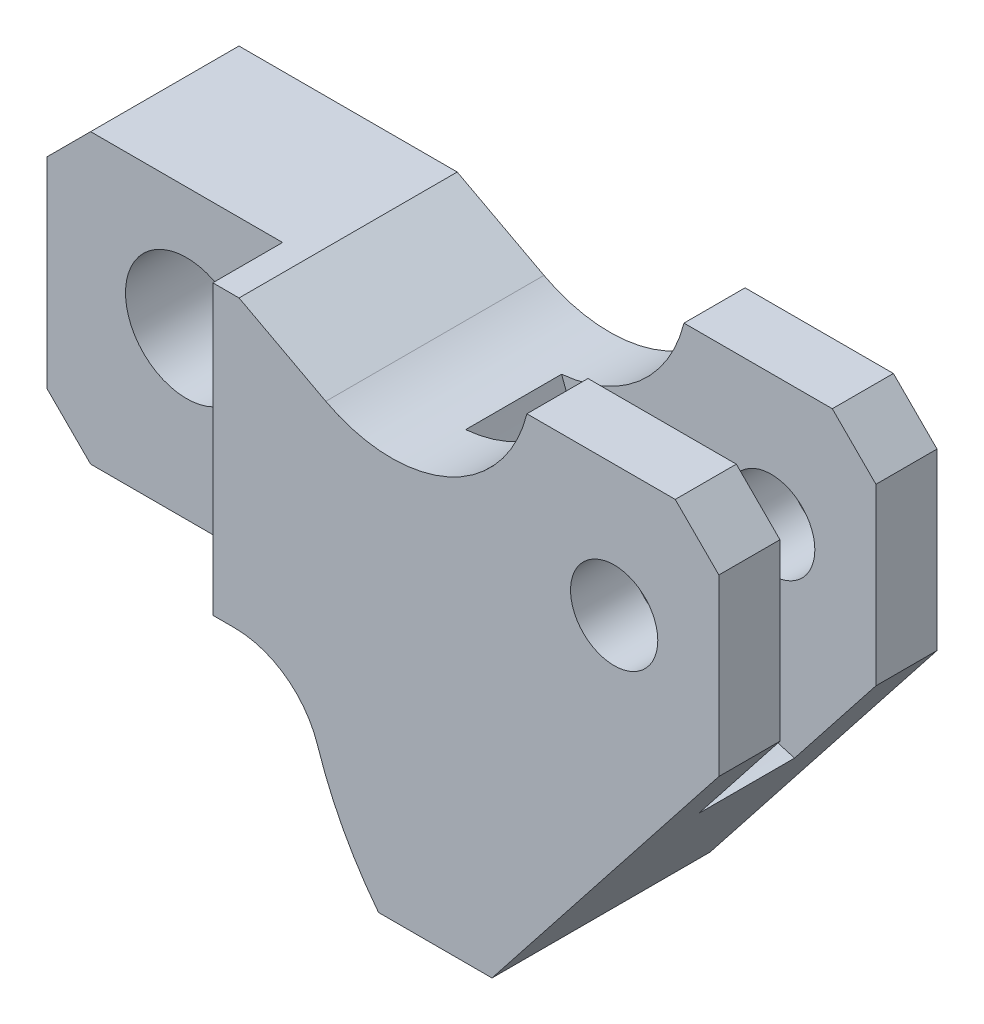
ISO-10303-21;
HEADER;
FILE_DESCRIPTION(('STEP AP214'),'2;1');
FILE_NAME('part.step','',(''),(''),'','','');
FILE_SCHEMA(('AUTOMOTIVE_DESIGN { 1 0 10303 214 1 1 1 1 }'));
ENDSEC;
DATA;
#1=APPLICATION_CONTEXT('core data for automotive mechanical design processes');
#2=APPLICATION_PROTOCOL_DEFINITION('international standard','automotive_design',2000,#1);
#3=PRODUCT_CONTEXT('',#1,'mechanical');
#4=PRODUCT('Part','Part','',(#3));
#5=PRODUCT_RELATED_PRODUCT_CATEGORY('part','',(#4));
#6=PRODUCT_DEFINITION_FORMATION('','',#4);
#7=PRODUCT_DEFINITION_CONTEXT('part definition',#1,'design');
#8=PRODUCT_DEFINITION('design','',#6,#7);
#9=PRODUCT_DEFINITION_SHAPE('','',#8);
#10=(LENGTH_UNIT() NAMED_UNIT(*) SI_UNIT(.MILLI.,.METRE.));
#11=(NAMED_UNIT(*) PLANE_ANGLE_UNIT() SI_UNIT($,.RADIAN.));
#12=(NAMED_UNIT(*) SI_UNIT($,.STERADIAN.) SOLID_ANGLE_UNIT());
#13=UNCERTAINTY_MEASURE_WITH_UNIT(LENGTH_MEASURE(1.E-05),#10,'distance_accuracy_value','');
#14=(GEOMETRIC_REPRESENTATION_CONTEXT(3) GLOBAL_UNCERTAINTY_ASSIGNED_CONTEXT((#13)) GLOBAL_UNIT_ASSIGNED_CONTEXT((#10,
#11,#12)) REPRESENTATION_CONTEXT('',''));
#15=CARTESIAN_POINT('',(0.,0.,0.));
#16=DIRECTION('',(0.,0.,1.));
#17=DIRECTION('',(1.,0.,0.));
#18=AXIS2_PLACEMENT_3D('',#15,#16,#17);
#19=CARTESIAN_POINT('',(37.5323662073748,0.,12.5));
#20=DIRECTION('',(1.,0.,0.));
#21=DIRECTION('',(0.,0.,-1.));
#22=AXIS2_PLACEMENT_3D('',#19,#20,#21);
#23=PLANE('',#22);
#24=DIRECTION('',(0.,0.,-1.));
#25=VECTOR('',#24,1.);
#26=CARTESIAN_POINT('',(37.5323662073748,-28.84,12.5));
#27=LINE('',#26,#25);
#28=CARTESIAN_POINT('',(37.5323662073748,-28.84,12.5));
#29=VERTEX_POINT('',#28);
#30=CARTESIAN_POINT('',(37.5323662073748,-28.84,5.5));
#31=VERTEX_POINT('',#30);
#32=EDGE_CURVE('E359',#29,#31,#27,.T.);
#33=ORIENTED_EDGE('',*,*,#32,.T.);
#34=DIRECTION('',(0.,1.,0.));
#35=VECTOR('',#34,1.);
#36=CARTESIAN_POINT('',(37.5323662073748,-8.84000000000003,5.5));
#37=LINE('',#36,#35);
#38=CARTESIAN_POINT('',(37.5323662073748,-8.84000000000003,5.5));
#39=VERTEX_POINT('',#38);
#40=EDGE_CURVE('E201',#31,#39,#37,.T.);
#41=ORIENTED_EDGE('',*,*,#40,.T.);
#42=DIRECTION('',(0.,0.,1.));
#43=VECTOR('',#42,1.);
#44=CARTESIAN_POINT('',(37.5323662073748,-8.84000000000003,12.5));
#45=LINE('',#44,#43);
#46=CARTESIAN_POINT('',(37.5323662073748,-8.84000000000003,12.5));
#47=VERTEX_POINT('',#46);
#48=EDGE_CURVE('E226',#39,#47,#45,.T.);
#49=ORIENTED_EDGE('',*,*,#48,.T.);
#50=DIRECTION('',(0.,-1.,0.));
#51=VECTOR('',#50,1.);
#52=CARTESIAN_POINT('',(37.5323662073748,0.,12.5));
#53=LINE('',#52,#51);
#54=EDGE_CURVE('E296',#47,#29,#53,.T.);
#55=ORIENTED_EDGE('',*,*,#54,.T.);
#56=EDGE_LOOP('',(#33,#41,#49,#55));
#57=FACE_BOUND('',#56,.T.);
#58=ADVANCED_FACE('F43',(#57),#23,.T.);
#59=CARTESIAN_POINT('',(0.,-3.84000000000001,12.5));
#60=DIRECTION('',(0.,1.,0.));
#61=DIRECTION('',(-1.,0.,0.));
#62=AXIS2_PLACEMENT_3D('',#59,#60,#61);
#63=PLANE('',#62);
#64=DIRECTION('',(0.,0.,-1.));
#65=VECTOR('',#64,1.);
#66=CARTESIAN_POINT('',(32.5323662073748,-3.84,12.5));
#67=LINE('',#66,#65);
#68=CARTESIAN_POINT('',(32.5323662073748,-3.84,12.5));
#69=VERTEX_POINT('',#68);
#70=CARTESIAN_POINT('',(32.5323662073748,-3.84,5.5));
#71=VERTEX_POINT('',#70);
#72=EDGE_CURVE('E216',#69,#71,#67,.T.);
#73=ORIENTED_EDGE('',*,*,#72,.T.);
#74=DIRECTION('',(-1.,0.,0.));
#75=VECTOR('',#74,1.);
#76=CARTESIAN_POINT('',(15.5323662073748,-3.84,5.5));
#77=LINE('',#76,#75);
#78=CARTESIAN_POINT('',(15.5323662073748,-3.84,5.5));
#79=VERTEX_POINT('',#78);
#80=EDGE_CURVE('E428',#71,#79,#77,.T.);
#81=ORIENTED_EDGE('',*,*,#80,.T.);
#82=DIRECTION('',(0.,0.,-1.));
#83=VECTOR('',#82,1.);
#84=CARTESIAN_POINT('',(15.5323662073748,-3.84,12.5));
#85=LINE('',#84,#83);
#86=CARTESIAN_POINT('',(15.5323662073748,-3.84,12.5));
#87=VERTEX_POINT('',#86);
#88=EDGE_CURVE('E353',#87,#79,#85,.T.);
#89=ORIENTED_EDGE('',*,*,#88,.F.);
#90=DIRECTION('',(1.,0.,0.));
#91=VECTOR('',#90,1.);
#92=CARTESIAN_POINT('',(0.,-3.84000000000001,12.5));
#93=LINE('',#92,#91);
#94=EDGE_CURVE('E302',#87,#69,#93,.T.);
#95=ORIENTED_EDGE('',*,*,#94,.T.);
#96=EDGE_LOOP('',(#73,#81,#89,#95));
#97=FACE_BOUND('',#96,.T.);
#98=ADVANCED_FACE('F450',(#97),#63,.T.);
#99=CARTESIAN_POINT('',(32.5323662073748,-3.84,12.5));
#100=DIRECTION('',(-0.707106781186549,-0.707106781186546,0.));
#101=DIRECTION('',(0.,0.,-1.));
#102=AXIS2_PLACEMENT_3D('',#99,#100,#101);
#103=PLANE('',#102);
#104=ORIENTED_EDGE('',*,*,#48,.F.);
#105=DIRECTION('',(-0.707106781186546,0.707106781186549,0.));
#106=VECTOR('',#105,1.);
#107=CARTESIAN_POINT('',(32.5323662073748,-3.84,5.5));
#108=LINE('',#107,#106);
#109=EDGE_CURVE('E422',#39,#71,#108,.T.);
#110=ORIENTED_EDGE('',*,*,#109,.T.);
#111=ORIENTED_EDGE('',*,*,#72,.F.);
#112=DIRECTION('',(0.707106781186546,-0.707106781186549,0.));
#113=VECTOR('',#112,1.);
#114=CARTESIAN_POINT('',(14.3461831036875,14.3461831036874,12.5));
#115=LINE('',#114,#113);
#116=EDGE_CURVE('E235',#47,#69,#115,.F.);
#117=ORIENTED_EDGE('',*,*,#116,.F.);
#118=EDGE_LOOP('',(#104,#110,#111,#117));
#119=FACE_BOUND('',#118,.T.);
#120=ADVANCED_FACE('F444',(#119),#103,.F.);
#121=CARTESIAN_POINT('',(37.1770350140687,-29.2909972838117,12.5));
#122=DIRECTION('',(0.785491672227536,-0.618872226603513,0.));
#123=DIRECTION('',(0.618872226603513,0.785491672227536,0.));
#124=AXIS2_PLACEMENT_3D('',#121,#122,#123);
#125=PLANE('',#124);
#126=DIRECTION('',(0.,0.,1.));
#127=VECTOR('',#126,1.);
#128=CARTESIAN_POINT('',(28.2057199185504,-40.677666443508,-5.5));
#129=LINE('',#128,#127);
#130=CARTESIAN_POINT('',(28.2057199185504,-40.677666443508,-5.5));
#131=VERTEX_POINT('',#130);
#132=CARTESIAN_POINT('',(28.2057199185504,-40.677666443508,5.5));
#133=VERTEX_POINT('',#132);
#134=EDGE_CURVE('E247',#131,#133,#129,.T.);
#135=ORIENTED_EDGE('',*,*,#134,.T.);
#136=DIRECTION('',(0.618872226603513,0.785491672227535,0.));
#137=VECTOR('',#136,1.);
#138=CARTESIAN_POINT('',(37.5323662073748,-28.84,5.5));
#139=LINE('',#138,#137);
#140=EDGE_CURVE('E434',#133,#31,#139,.T.);
#141=ORIENTED_EDGE('',*,*,#140,.T.);
#142=ORIENTED_EDGE('',*,*,#32,.F.);
#143=DIRECTION('',(-0.618872226603513,-0.785491672227536,0.));
#144=VECTOR('',#143,1.);
#145=CARTESIAN_POINT('',(37.1770350140687,-29.2909972838117,12.5));
#146=LINE('',#145,#144);
#147=CARTESIAN_POINT('',(11.5323662073748,-61.84,12.5));
#148=VERTEX_POINT('',#147);
#149=EDGE_CURVE('E297',#29,#148,#146,.T.);
#150=ORIENTED_EDGE('',*,*,#149,.T.);
#151=DIRECTION('',(0.,0.,-1.));
#152=VECTOR('',#151,1.);
#153=CARTESIAN_POINT('',(11.5323662073748,-61.84,12.5));
#154=LINE('',#153,#152);
#155=CARTESIAN_POINT('',(11.5323662073748,-61.84,-12.5));
#156=VERTEX_POINT('',#155);
#157=EDGE_CURVE('E362',#148,#156,#154,.T.);
#158=ORIENTED_EDGE('',*,*,#157,.T.);
#159=DIRECTION('',(-0.618872226603513,-0.785491672227536,0.));
#160=VECTOR('',#159,1.);
#161=CARTESIAN_POINT('',(37.1770350140687,-29.2909972838117,-12.5));
#162=LINE('',#161,#160);
#163=CARTESIAN_POINT('',(37.5323662073748,-28.84,-12.5));
#164=VERTEX_POINT('',#163);
#165=EDGE_CURVE('E329',#164,#156,#162,.T.);
#166=ORIENTED_EDGE('',*,*,#165,.F.);
#167=CARTESIAN_POINT('',(37.5323662073748,-28.84,-5.5));
#168=VERTEX_POINT('',#167);
#169=EDGE_CURVE('E358',#168,#164,#27,.T.);
#170=ORIENTED_EDGE('',*,*,#169,.F.);
#171=DIRECTION('',(0.618872226603513,0.785491672227535,0.));
#172=VECTOR('',#171,1.);
#173=CARTESIAN_POINT('',(37.5323662073748,-28.84,-5.5));
#174=LINE('',#173,#172);
#175=EDGE_CURVE('E419',#131,#168,#174,.T.);
#176=ORIENTED_EDGE('',*,*,#175,.F.);
#177=EDGE_LOOP('',(#135,#141,#142,#150,#158,#166,#170,#176));
#178=FACE_BOUND('',#177,.T.);
#179=ADVANCED_FACE('F453',(#178),#125,.T.);
#180=CARTESIAN_POINT('',(0.,0.,12.5));
#181=DIRECTION('',(0.,0.,-1.));
#182=DIRECTION('',(-1.,0.,0.));
#183=AXIS2_PLACEMENT_3D('',#180,#181,#182);
#184=CYLINDRICAL_SURFACE('',#183,16.);
#185=ORIENTED_EDGE('',*,*,#88,.T.);
#186=CARTESIAN_POINT('',(0.,0.,5.5));
#187=DIRECTION('',(0.,0.,-1.));
#188=DIRECTION('',(1.,0.,0.));
#189=AXIS2_PLACEMENT_3D('',#186,#187,#188);
#190=CIRCLE('',#189,16.);
#191=CARTESIAN_POINT('',(1.50656721275613,-15.9289125565259,5.5));
#192=VERTEX_POINT('',#191);
#193=EDGE_CURVE('E431',#79,#192,#190,.T.);
#194=ORIENTED_EDGE('',*,*,#193,.T.);
#195=DIRECTION('',(0.,0.,1.));
#196=VECTOR('',#195,1.);
#197=CARTESIAN_POINT('',(1.50656721275613,-15.9289125565259,-5.5));
#198=LINE('',#197,#196);
#199=CARTESIAN_POINT('',(1.50656721275613,-15.9289125565259,-5.5));
#200=VERTEX_POINT('',#199);
#201=EDGE_CURVE('E252',#200,#192,#198,.T.);
#202=ORIENTED_EDGE('',*,*,#201,.F.);
#203=CARTESIAN_POINT('',(0.,0.,-5.5));
#204=DIRECTION('',(0.,0.,-1.));
#205=DIRECTION('',(1.,0.,0.));
#206=AXIS2_PLACEMENT_3D('',#203,#204,#205);
#207=CIRCLE('',#206,16.);
#208=CARTESIAN_POINT('',(15.5323662073748,-3.84,-5.5));
#209=VERTEX_POINT('',#208);
#210=EDGE_CURVE('E62',#209,#200,#207,.T.);
#211=ORIENTED_EDGE('',*,*,#210,.F.);
#212=CARTESIAN_POINT('',(15.5323662073748,-3.84,-12.5));
#213=VERTEX_POINT('',#212);
#214=EDGE_CURVE('E211',#209,#213,#85,.T.);
#215=ORIENTED_EDGE('',*,*,#214,.T.);
#216=CARTESIAN_POINT('',(0.,0.,-12.5));
#217=DIRECTION('',(0.,0.,1.));
#218=DIRECTION('',(1.,0.,0.));
#219=AXIS2_PLACEMENT_3D('',#216,#217,#218);
#220=CIRCLE('',#219,16.);
#221=CARTESIAN_POINT('',(-7.51154500457427,-14.1271614857428,-12.5));
#222=VERTEX_POINT('',#221);
#223=EDGE_CURVE('E339',#222,#213,#220,.T.);
#224=ORIENTED_EDGE('',*,*,#223,.F.);
#225=DIRECTION('',(0.,0.,-1.));
#226=VECTOR('',#225,1.);
#227=CARTESIAN_POINT('',(-7.51154500457427,-14.1271614857428,12.5));
#228=LINE('',#227,#226);
#229=CARTESIAN_POINT('',(-7.51154500457427,-14.1271614857428,12.5));
#230=VERTEX_POINT('',#229);
#231=EDGE_CURVE('E354',#230,#222,#228,.T.);
#232=ORIENTED_EDGE('',*,*,#231,.F.);
#233=CARTESIAN_POINT('',(0.,0.,12.5));
#234=DIRECTION('',(0.,0.,1.));
#235=DIRECTION('',(1.,0.,0.));
#236=AXIS2_PLACEMENT_3D('',#233,#234,#235);
#237=CIRCLE('',#236,16.);
#238=EDGE_CURVE('E304',#230,#87,#237,.T.);
#239=ORIENTED_EDGE('',*,*,#238,.T.);
#240=EDGE_LOOP('',(#185,#194,#202,#211,#215,#224,#232,#239));
#241=FACE_BOUND('',#240,.T.);
#242=ADVANCED_FACE('F414',(#241),#184,.F.);
#243=CARTESIAN_POINT('',(25.5323662073748,-18.84,12.5));
#244=DIRECTION('',(0.,0.,-1.));
#245=DIRECTION('',(-1.,0.,0.));
#246=AXIS2_PLACEMENT_3D('',#243,#244,#245);
#247=CYLINDRICAL_SURFACE('',#246,5.);
#248=CARTESIAN_POINT('',(25.5323662073748,-18.84,-12.5));
#249=DIRECTION('',(0.,0.,1.));
#250=DIRECTION('',(1.,0.,0.));
#251=AXIS2_PLACEMENT_3D('',#248,#249,#250);
#252=CIRCLE('',#251,5.);
#253=CARTESIAN_POINT('',(30.5323662073748,-18.84,-12.5));
#254=VERTEX_POINT('',#253);
#255=EDGE_CURVE('E290',#254,#254,#252,.T.);
#256=ORIENTED_EDGE('',*,*,#255,.F.);
#257=EDGE_LOOP('',(#256));
#258=FACE_BOUND('',#257,.T.);
#259=CARTESIAN_POINT('',(25.5323662073748,-18.84,-5.5));
#260=DIRECTION('',(0.,0.,1.));
#261=DIRECTION('',(1.,0.,0.));
#262=AXIS2_PLACEMENT_3D('',#259,#260,#261);
#263=CIRCLE('',#262,5.);
#264=CARTESIAN_POINT('',(30.5323662073748,-18.84,-5.5));
#265=VERTEX_POINT('',#264);
#266=EDGE_CURVE('E48',#265,#265,#263,.T.);
#267=ORIENTED_EDGE('',*,*,#266,.T.);
#268=EDGE_LOOP('',(#267));
#269=FACE_BOUND('',#268,.T.);
#270=ADVANCED_FACE('F479',(#258,#269),#247,.F.);
#271=CARTESIAN_POINT('',(0.,-41.84,12.5));
#272=DIRECTION('',(0.,-1.,0.));
#273=DIRECTION('',(1.,0.,0.));
#274=AXIS2_PLACEMENT_3D('',#271,#272,#273);
#275=PLANE('',#274);
#276=DIRECTION('',(-1.,0.,0.));
#277=VECTOR('',#276,1.);
#278=CARTESIAN_POINT('',(0.,-41.84,4.5));
#279=LINE('',#278,#277);
#280=CARTESIAN_POINT('',(-20.4676337926252,-41.84,4.5));
#281=VERTEX_POINT('',#280);
#282=CARTESIAN_POINT('',(-42.4676337926252,-41.84,4.5));
#283=VERTEX_POINT('',#282);
#284=EDGE_CURVE('E275',#281,#283,#279,.T.);
#285=ORIENTED_EDGE('',*,*,#284,.T.);
#286=DIRECTION('',(0.,0.,-1.));
#287=VECTOR('',#286,1.);
#288=CARTESIAN_POINT('',(-42.4676337926252,-41.84,12.5));
#289=LINE('',#288,#287);
#290=CARTESIAN_POINT('',(-42.4676337926252,-41.84,-12.5));
#291=VERTEX_POINT('',#290);
#292=EDGE_CURVE('E234',#283,#291,#289,.T.);
#293=ORIENTED_EDGE('',*,*,#292,.T.);
#294=DIRECTION('',(-1.,0.,0.));
#295=VECTOR('',#294,1.);
#296=CARTESIAN_POINT('',(0.,-41.84,-12.5));
#297=LINE('',#296,#295);
#298=CARTESIAN_POINT('',(-17.965724564909,-41.84,-12.5));
#299=VERTEX_POINT('',#298);
#300=EDGE_CURVE('E318',#299,#291,#297,.T.);
#301=ORIENTED_EDGE('',*,*,#300,.F.);
#302=DIRECTION('',(0.,0.,-1.));
#303=VECTOR('',#302,1.);
#304=CARTESIAN_POINT('',(-17.965724564909,-41.84,12.5));
#305=LINE('',#304,#303);
#306=CARTESIAN_POINT('',(-17.965724564909,-41.84,12.5));
#307=VERTEX_POINT('',#306);
#308=EDGE_CURVE('E220',#307,#299,#305,.T.);
#309=ORIENTED_EDGE('',*,*,#308,.F.);
#310=DIRECTION('',(-1.,0.,0.));
#311=VECTOR('',#310,1.);
#312=CARTESIAN_POINT('',(0.,-41.84,12.5));
#313=LINE('',#312,#311);
#314=CARTESIAN_POINT('',(-20.4676337926252,-41.84,12.5));
#315=VERTEX_POINT('',#314);
#316=EDGE_CURVE('E284',#307,#315,#313,.T.);
#317=ORIENTED_EDGE('',*,*,#316,.T.);
#318=DIRECTION('',(0.,0.,1.));
#319=VECTOR('',#318,1.);
#320=CARTESIAN_POINT('',(-20.4676337926252,-41.84,4.5));
#321=LINE('',#320,#319);
#322=EDGE_CURVE('E279',#281,#315,#321,.T.);
#323=ORIENTED_EDGE('',*,*,#322,.F.);
#324=EDGE_LOOP('',(#285,#293,#301,#309,#317,#323));
#325=FACE_BOUND('',#324,.T.);
#326=ADVANCED_FACE('F388',(#325),#275,.T.);
#327=CARTESIAN_POINT('',(0.,-8.84000000000001,12.5));
#328=DIRECTION('',(0.,1.,0.));
#329=DIRECTION('',(0.,0.,1.));
#330=AXIS2_PLACEMENT_3D('',#327,#328,#329);
#331=PLANE('',#330);
#332=DIRECTION('',(1.,0.,0.));
#333=VECTOR('',#332,1.);
#334=CARTESIAN_POINT('',(0.,-8.84000000000001,-12.5));
#335=LINE('',#334,#333);
#336=CARTESIAN_POINT('',(-42.4676337926252,-8.84000000000001,-12.5));
#337=VERTEX_POINT('',#336);
#338=CARTESIAN_POINT('',(-17.4552495373706,-8.84000000000001,-12.5));
#339=VERTEX_POINT('',#338);
#340=EDGE_CURVE('E344',#337,#339,#335,.T.);
#341=ORIENTED_EDGE('',*,*,#340,.F.);
#342=DIRECTION('',(0.,0.,1.));
#343=VECTOR('',#342,1.);
#344=CARTESIAN_POINT('',(-42.4676337926252,-8.84000000000001,12.5));
#345=LINE('',#344,#343);
#346=CARTESIAN_POINT('',(-42.4676337926252,-8.84000000000001,4.5));
#347=VERTEX_POINT('',#346);
#348=EDGE_CURVE('E11',#337,#347,#345,.T.);
#349=ORIENTED_EDGE('',*,*,#348,.T.);
#350=DIRECTION('',(1.,0.,0.));
#351=VECTOR('',#350,1.);
#352=CARTESIAN_POINT('',(0.,-8.84000000000001,4.5));
#353=LINE('',#352,#351);
#354=CARTESIAN_POINT('',(-20.4676337926252,-8.84000000000001,4.5));
#355=VERTEX_POINT('',#354);
#356=EDGE_CURVE('E270',#347,#355,#353,.T.);
#357=ORIENTED_EDGE('',*,*,#356,.T.);
#358=DIRECTION('',(0.,0.,1.));
#359=VECTOR('',#358,1.);
#360=CARTESIAN_POINT('',(-20.4676337926252,-8.84000000000001,4.5));
#361=LINE('',#360,#359);
#362=CARTESIAN_POINT('',(-20.4676337926252,-8.84000000000001,12.5));
#363=VERTEX_POINT('',#362);
#364=EDGE_CURVE('E274',#355,#363,#361,.T.);
#365=ORIENTED_EDGE('',*,*,#364,.T.);
#366=DIRECTION('',(1.,0.,0.));
#367=VECTOR('',#366,1.);
#368=CARTESIAN_POINT('',(0.,-8.84000000000001,12.5));
#369=LINE('',#368,#367);
#370=CARTESIAN_POINT('',(-17.4552495373706,-8.84000000000001,12.5));
#371=VERTEX_POINT('',#370);
#372=EDGE_CURVE('E309',#363,#371,#369,.T.);
#373=ORIENTED_EDGE('',*,*,#372,.T.);
#374=DIRECTION('',(0.,0.,-1.));
#375=VECTOR('',#374,1.);
#376=CARTESIAN_POINT('',(-17.4552495373706,-8.84000000000001,12.5));
#377=LINE('',#376,#375);
#378=EDGE_CURVE('E312',#371,#339,#377,.T.);
#379=ORIENTED_EDGE('',*,*,#378,.T.);
#380=EDGE_LOOP('',(#341,#349,#357,#365,#373,#379));
#381=FACE_BOUND('',#380,.T.);
#382=ADVANCED_FACE('F407',(#381),#331,.T.);
#383=CARTESIAN_POINT('',(-47.4676337926252,0.,12.5));
#384=DIRECTION('',(-1.,0.,0.));
#385=DIRECTION('',(0.,0.,1.));
#386=AXIS2_PLACEMENT_3D('',#383,#384,#385);
#387=PLANE('',#386);
#388=DIRECTION('',(0.,1.,0.));
#389=VECTOR('',#388,1.);
#390=CARTESIAN_POINT('',(-47.4676337926252,0.,-12.5));
#391=LINE('',#390,#389);
#392=CARTESIAN_POINT('',(-47.4676337926252,-36.84,-12.5));
#393=VERTEX_POINT('',#392);
#394=CARTESIAN_POINT('',(-47.4676337926252,-13.84,-12.5));
#395=VERTEX_POINT('',#394);
#396=EDGE_CURVE('E347',#393,#395,#391,.T.);
#397=ORIENTED_EDGE('',*,*,#396,.F.);
#398=DIRECTION('',(0.,0.,1.));
#399=VECTOR('',#398,1.);
#400=CARTESIAN_POINT('',(-47.4676337926252,-36.84,12.5));
#401=LINE('',#400,#399);
#402=CARTESIAN_POINT('',(-47.4676337926252,-36.84,4.5));
#403=VERTEX_POINT('',#402);
#404=EDGE_CURVE('E238',#393,#403,#401,.T.);
#405=ORIENTED_EDGE('',*,*,#404,.T.);
#406=DIRECTION('',(0.,1.,0.));
#407=VECTOR('',#406,1.);
#408=CARTESIAN_POINT('',(-47.4676337926252,0.,4.5));
#409=LINE('',#408,#407);
#410=CARTESIAN_POINT('',(-47.4676337926252,-13.84,4.5));
#411=VERTEX_POINT('',#410);
#412=EDGE_CURVE('E267',#403,#411,#409,.T.);
#413=ORIENTED_EDGE('',*,*,#412,.T.);
#414=DIRECTION('',(0.,0.,-1.));
#415=VECTOR('',#414,1.);
#416=CARTESIAN_POINT('',(-47.4676337926252,-13.84,12.5));
#417=LINE('',#416,#415);
#418=EDGE_CURVE('E240',#411,#395,#417,.T.);
#419=ORIENTED_EDGE('',*,*,#418,.T.);
#420=EDGE_LOOP('',(#397,#405,#413,#419));
#421=FACE_BOUND('',#420,.T.);
#422=ADVANCED_FACE('F397',(#421),#387,.T.);
#423=CARTESIAN_POINT('',(0.,0.,12.5));
#424=DIRECTION('',(0.,0.,1.));
#425=DIRECTION('',(1.,0.,0.));
#426=AXIS2_PLACEMENT_3D('',#423,#424,#425);
#427=PLANE('',#426);
#428=CARTESIAN_POINT('',(25.5323662073748,-18.84,12.5));
#429=DIRECTION('',(0.,0.,1.));
#430=DIRECTION('',(1.,0.,0.));
#431=AXIS2_PLACEMENT_3D('',#428,#429,#430);
#432=CIRCLE('',#431,5.);
#433=CARTESIAN_POINT('',(30.5323662073748,-18.84,12.5));
#434=VERTEX_POINT('',#433);
#435=EDGE_CURVE('E315',#434,#434,#432,.T.);
#436=ORIENTED_EDGE('',*,*,#435,.F.);
#437=EDGE_LOOP('',(#436));
#438=FACE_BOUND('',#437,.T.);
#439=ORIENTED_EDGE('',*,*,#54,.F.);
#440=ORIENTED_EDGE('',*,*,#116,.T.);
#441=ORIENTED_EDGE('',*,*,#94,.F.);
#442=ORIENTED_EDGE('',*,*,#238,.F.);
#443=DIRECTION('',(0.882947592858927,-0.469471562785891,0.));
#444=VECTOR('',#443,1.);
#445=CARTESIAN_POINT('',(-7.51154500457425,-14.1271614857428,12.5));
#446=LINE('',#445,#444);
#447=EDGE_CURVE('E307',#371,#230,#446,.T.);
#448=ORIENTED_EDGE('',*,*,#447,.F.);
#449=ORIENTED_EDGE('',*,*,#372,.F.);
#450=DIRECTION('',(0.,-1.,0.));
#451=VECTOR('',#450,1.);
#452=CARTESIAN_POINT('',(-20.4676337926252,0.,12.5));
#453=LINE('',#452,#451);
#454=EDGE_CURVE('E246',#363,#315,#453,.T.);
#455=ORIENTED_EDGE('',*,*,#454,.T.);
#456=ORIENTED_EDGE('',*,*,#316,.F.);
#457=CARTESIAN_POINT('',(-17.965724564909,-51.84,12.5));
#458=DIRECTION('',(0.,0.,1.));
#459=DIRECTION('',(1.,0.,0.));
#460=AXIS2_PLACEMENT_3D('',#457,#458,#459);
#461=CIRCLE('',#460,10.);
#462=CARTESIAN_POINT('',(-8.46208179336581,-48.7286057673618,12.5));
#463=VERTEX_POINT('',#462);
#464=EDGE_CURVE('E287',#463,#307,#461,.T.);
#465=ORIENTED_EDGE('',*,*,#464,.F.);
#466=CARTESIAN_POINT('',(32.4035821242701,-35.3496105670176,12.5));
#467=DIRECTION('',(0.,0.,1.));
#468=DIRECTION('',(1.,0.,0.));
#469=AXIS2_PLACEMENT_3D('',#466,#467,#468);
#470=CIRCLE('',#469,43.);
#471=CARTESIAN_POINT('',(-1.46763379262515,-61.84,12.5));
#472=VERTEX_POINT('',#471);
#473=EDGE_CURVE('E286',#472,#463,#470,.F.);
#474=ORIENTED_EDGE('',*,*,#473,.F.);
#475=DIRECTION('',(-1.,0.,0.));
#476=VECTOR('',#475,1.);
#477=CARTESIAN_POINT('',(0.,-61.84,12.5));
#478=LINE('',#477,#476);
#479=EDGE_CURVE('E291',#148,#472,#478,.T.);
#480=ORIENTED_EDGE('',*,*,#479,.F.);
#481=ORIENTED_EDGE('',*,*,#149,.F.);
#482=EDGE_LOOP('',(#439,#440,#441,#442,#448,#449,#455,#456,#465,#474,#480,#481));
#483=FACE_BOUND('',#482,.T.);
#484=ADVANCED_FACE('F383',(#438,#483),#427,.T.);
#485=CARTESIAN_POINT('',(-31.4676337926252,-22.84,12.5));
#486=DIRECTION('',(0.,0.,-1.));
#487=DIRECTION('',(-1.,0.,0.));
#488=AXIS2_PLACEMENT_3D('',#485,#486,#487);
#489=CYLINDRICAL_SURFACE('',#488,7.);
#490=CARTESIAN_POINT('',(-31.4676337926252,-22.84,-12.5));
#491=DIRECTION('',(0.,0.,1.));
#492=DIRECTION('',(1.,0.,0.));
#493=AXIS2_PLACEMENT_3D('',#490,#491,#492);
#494=CIRCLE('',#493,7.);
#495=CARTESIAN_POINT('',(-24.4676337926252,-22.84,-12.5));
#496=VERTEX_POINT('',#495);
#497=EDGE_CURVE('E278',#496,#496,#494,.T.);
#498=ORIENTED_EDGE('',*,*,#497,.F.);
#499=EDGE_LOOP('',(#498));
#500=FACE_BOUND('',#499,.T.);
#501=CARTESIAN_POINT('',(-31.4676337926252,-22.84,4.5));
#502=DIRECTION('',(0.,0.,1.));
#503=DIRECTION('',(1.,0.,0.));
#504=AXIS2_PLACEMENT_3D('',#501,#502,#503);
#505=CIRCLE('',#504,7.);
#506=CARTESIAN_POINT('',(-24.4676337926252,-22.84,4.5));
#507=VERTEX_POINT('',#506);
#508=EDGE_CURVE('E261',#507,#507,#505,.T.);
#509=ORIENTED_EDGE('',*,*,#508,.T.);
#510=EDGE_LOOP('',(#509));
#511=FACE_BOUND('',#510,.T.);
#512=ADVANCED_FACE('F497',(#500,#511),#489,.F.);
#513=CARTESIAN_POINT('',(-17.965724564909,-51.84,12.5));
#514=DIRECTION('',(0.,0.,-1.));
#515=DIRECTION('',(-1.,0.,0.));
#516=AXIS2_PLACEMENT_3D('',#513,#514,#515);
#517=CYLINDRICAL_SURFACE('',#516,10.);
#518=CARTESIAN_POINT('',(-17.965724564909,-51.84,-12.5));
#519=DIRECTION('',(0.,0.,1.));
#520=DIRECTION('',(1.,0.,0.));
#521=AXIS2_PLACEMENT_3D('',#518,#519,#520);
#522=CIRCLE('',#521,10.);
#523=CARTESIAN_POINT('',(-8.46208179336581,-48.7286057673618,-12.5));
#524=VERTEX_POINT('',#523);
#525=EDGE_CURVE('E321',#524,#299,#522,.T.);
#526=ORIENTED_EDGE('',*,*,#525,.F.);
#527=DIRECTION('',(0.,0.,-1.));
#528=VECTOR('',#527,1.);
#529=CARTESIAN_POINT('',(-8.46208179336581,-48.7286057673618,12.5));
#530=LINE('',#529,#528);
#531=EDGE_CURVE('E222',#463,#524,#530,.T.);
#532=ORIENTED_EDGE('',*,*,#531,.F.);
#533=ORIENTED_EDGE('',*,*,#464,.T.);
#534=ORIENTED_EDGE('',*,*,#308,.T.);
#535=EDGE_LOOP('',(#526,#532,#533,#534));
#536=FACE_BOUND('',#535,.T.);
#537=ADVANCED_FACE('F375',(#536),#517,.F.);
#538=CARTESIAN_POINT('',(32.4035821242701,-35.3496105670176,12.5));
#539=DIRECTION('',(0.,0.,-1.));
#540=DIRECTION('',(-1.,0.,0.));
#541=AXIS2_PLACEMENT_3D('',#538,#539,#540);
#542=CYLINDRICAL_SURFACE('',#541,43.);
#543=CARTESIAN_POINT('',(32.4035821242701,-35.3496105670176,-12.5));
#544=DIRECTION('',(0.,0.,1.));
#545=DIRECTION('',(1.,0.,0.));
#546=AXIS2_PLACEMENT_3D('',#543,#544,#545);
#547=CIRCLE('',#546,43.);
#548=CARTESIAN_POINT('',(-1.46763379262515,-61.84,-12.5));
#549=VERTEX_POINT('',#548);
#550=EDGE_CURVE('E322',#549,#524,#547,.F.);
#551=ORIENTED_EDGE('',*,*,#550,.F.);
#552=DIRECTION('',(0.,0.,-1.));
#553=VECTOR('',#552,1.);
#554=CARTESIAN_POINT('',(-1.46763379262515,-61.84,12.5));
#555=LINE('',#554,#553);
#556=EDGE_CURVE('E365',#472,#549,#555,.T.);
#557=ORIENTED_EDGE('',*,*,#556,.F.);
#558=ORIENTED_EDGE('',*,*,#473,.T.);
#559=ORIENTED_EDGE('',*,*,#531,.T.);
#560=EDGE_LOOP('',(#551,#557,#558,#559));
#561=FACE_BOUND('',#560,.T.);
#562=ADVANCED_FACE('F366',(#561),#542,.T.);
#563=CARTESIAN_POINT('',(0.,-61.84,12.5));
#564=DIRECTION('',(0.,-1.,0.));
#565=DIRECTION('',(1.,0.,0.));
#566=AXIS2_PLACEMENT_3D('',#563,#564,#565);
#567=PLANE('',#566);
#568=DIRECTION('',(-1.,0.,0.));
#569=VECTOR('',#568,1.);
#570=CARTESIAN_POINT('',(0.,-61.84,-12.5));
#571=LINE('',#570,#569);
#572=EDGE_CURVE('E330',#156,#549,#571,.T.);
#573=ORIENTED_EDGE('',*,*,#572,.F.);
#574=ORIENTED_EDGE('',*,*,#157,.F.);
#575=ORIENTED_EDGE('',*,*,#479,.T.);
#576=ORIENTED_EDGE('',*,*,#556,.T.);
#577=EDGE_LOOP('',(#573,#574,#575,#576));
#578=FACE_BOUND('',#577,.T.);
#579=ADVANCED_FACE('F379',(#578),#567,.T.);
#580=DIRECTION('',(0.,1.,0.));
#581=VECTOR('',#580,1.);
#582=CARTESIAN_POINT('',(37.5323662073748,-8.84000000000003,-5.5));
#583=LINE('',#582,#581);
#584=CARTESIAN_POINT('',(37.5323662073748,-8.84000000000003,-5.5));
#585=VERTEX_POINT('',#584);
#586=EDGE_CURVE('E196',#168,#585,#583,.T.);
#587=ORIENTED_EDGE('',*,*,#586,.F.);
#588=ORIENTED_EDGE('',*,*,#169,.T.);
#589=DIRECTION('',(0.,-1.,0.));
#590=VECTOR('',#589,1.);
#591=CARTESIAN_POINT('',(37.5323662073748,0.,-12.5));
#592=LINE('',#591,#590);
#593=CARTESIAN_POINT('',(37.5323662073748,-8.84000000000003,-12.5));
#594=VERTEX_POINT('',#593);
#595=EDGE_CURVE('E334',#594,#164,#592,.T.);
#596=ORIENTED_EDGE('',*,*,#595,.F.);
#597=EDGE_CURVE('E228',#594,#585,#45,.T.);
#598=ORIENTED_EDGE('',*,*,#597,.T.);
#599=EDGE_LOOP('',(#587,#588,#596,#598));
#600=FACE_BOUND('',#599,.T.);
#601=ADVANCED_FACE('F457',(#600),#23,.T.);
#602=DIRECTION('',(-1.,0.,0.));
#603=VECTOR('',#602,1.);
#604=CARTESIAN_POINT('',(15.5323662073748,-3.84,-5.5));
#605=LINE('',#604,#603);
#606=CARTESIAN_POINT('',(32.5323662073748,-3.84,-5.5));
#607=VERTEX_POINT('',#606);
#608=EDGE_CURVE('E198',#607,#209,#605,.T.);
#609=ORIENTED_EDGE('',*,*,#608,.F.);
#610=CARTESIAN_POINT('',(32.5323662073748,-3.84,-12.5));
#611=VERTEX_POINT('',#610);
#612=EDGE_CURVE('E207',#607,#611,#67,.T.);
#613=ORIENTED_EDGE('',*,*,#612,.T.);
#614=DIRECTION('',(1.,0.,0.));
#615=VECTOR('',#614,1.);
#616=CARTESIAN_POINT('',(0.,-3.84000000000001,-12.5));
#617=LINE('',#616,#615);
#618=EDGE_CURVE('E337',#213,#611,#617,.T.);
#619=ORIENTED_EDGE('',*,*,#618,.F.);
#620=ORIENTED_EDGE('',*,*,#214,.F.);
#621=EDGE_LOOP('',(#609,#613,#619,#620));
#622=FACE_BOUND('',#621,.T.);
#623=ADVANCED_FACE('F210',(#622),#63,.T.);
#624=CARTESIAN_POINT('',(-7.51154500457425,-14.1271614857428,12.5));
#625=DIRECTION('',(0.469471562785891,0.882947592858927,0.));
#626=DIRECTION('',(-0.882947592858927,0.469471562785891,0.));
#627=AXIS2_PLACEMENT_3D('',#624,#625,#626);
#628=PLANE('',#627);
#629=DIRECTION('',(0.882947592858927,-0.469471562785891,0.));
#630=VECTOR('',#629,1.);
#631=CARTESIAN_POINT('',(-7.51154500457425,-14.1271614857428,-12.5));
#632=LINE('',#631,#630);
#633=EDGE_CURVE('E342',#339,#222,#632,.T.);
#634=ORIENTED_EDGE('',*,*,#633,.F.);
#635=ORIENTED_EDGE('',*,*,#378,.F.);
#636=ORIENTED_EDGE('',*,*,#447,.T.);
#637=ORIENTED_EDGE('',*,*,#231,.T.);
#638=EDGE_LOOP('',(#634,#635,#636,#637));
#639=FACE_BOUND('',#638,.T.);
#640=ADVANCED_FACE('F412',(#639),#628,.T.);
#641=CARTESIAN_POINT('',(25.5323662073748,-18.84,5.5));
#642=DIRECTION('',(0.,0.,1.));
#643=DIRECTION('',(1.,0.,0.));
#644=AXIS2_PLACEMENT_3D('',#641,#642,#643);
#645=CIRCLE('',#644,5.);
#646=CARTESIAN_POINT('',(30.5323662073748,-18.84,5.5));
#647=VERTEX_POINT('',#646);
#648=EDGE_CURVE('E241',#647,#647,#645,.T.);
#649=ORIENTED_EDGE('',*,*,#648,.F.);
#650=EDGE_LOOP('',(#649));
#651=FACE_BOUND('',#650,.T.);
#652=ORIENTED_EDGE('',*,*,#435,.T.);
#653=EDGE_LOOP('',(#652));
#654=FACE_BOUND('',#653,.T.);
#655=ADVANCED_FACE('F485',(#651,#654),#247,.F.);
#656=CARTESIAN_POINT('',(0.,0.,-12.5));
#657=DIRECTION('',(0.,0.,1.));
#658=DIRECTION('',(1.,0.,0.));
#659=AXIS2_PLACEMENT_3D('',#656,#657,#658);
#660=PLANE('',#659);
#661=ORIENTED_EDGE('',*,*,#497,.T.);
#662=EDGE_LOOP('',(#661));
#663=FACE_BOUND('',#662,.T.);
#664=ORIENTED_EDGE('',*,*,#618,.T.);
#665=DIRECTION('',(-0.707106781186546,0.707106781186549,0.));
#666=VECTOR('',#665,1.);
#667=CARTESIAN_POINT('',(32.5323662073748,-3.84,-12.5));
#668=LINE('',#667,#666);
#669=EDGE_CURVE('E212',#611,#594,#668,.F.);
#670=ORIENTED_EDGE('',*,*,#669,.T.);
#671=ORIENTED_EDGE('',*,*,#595,.T.);
#672=ORIENTED_EDGE('',*,*,#165,.T.);
#673=ORIENTED_EDGE('',*,*,#572,.T.);
#674=ORIENTED_EDGE('',*,*,#550,.T.);
#675=ORIENTED_EDGE('',*,*,#525,.T.);
#676=ORIENTED_EDGE('',*,*,#300,.T.);
#677=DIRECTION('',(0.707106781186546,-0.707106781186549,0.));
#678=VECTOR('',#677,1.);
#679=CARTESIAN_POINT('',(-42.4676337926252,-41.84,-12.5));
#680=LINE('',#679,#678);
#681=EDGE_CURVE('E227',#291,#393,#680,.F.);
#682=ORIENTED_EDGE('',*,*,#681,.T.);
#683=ORIENTED_EDGE('',*,*,#396,.T.);
#684=DIRECTION('',(-0.707106781186549,-0.707106781186547,0.));
#685=VECTOR('',#684,1.);
#686=CARTESIAN_POINT('',(-47.4676337926252,-13.84,-12.5));
#687=LINE('',#686,#685);
#688=EDGE_CURVE('E219',#395,#337,#687,.F.);
#689=ORIENTED_EDGE('',*,*,#688,.T.);
#690=ORIENTED_EDGE('',*,*,#340,.T.);
#691=ORIENTED_EDGE('',*,*,#633,.T.);
#692=ORIENTED_EDGE('',*,*,#223,.T.);
#693=EDGE_LOOP('',(#664,#670,#671,#672,#673,#674,#675,#676,#682,#683,#689,#690,#691,#692));
#694=FACE_BOUND('',#693,.T.);
#695=ORIENTED_EDGE('',*,*,#255,.T.);
#696=EDGE_LOOP('',(#695));
#697=FACE_BOUND('',#696,.T.);
#698=ADVANCED_FACE('F374',(#663,#694,#697),#660,.F.);
#699=CARTESIAN_POINT('',(-20.4676337926252,0.,4.5));
#700=DIRECTION('',(-1.,0.,0.));
#701=DIRECTION('',(0.,-1.,0.));
#702=AXIS2_PLACEMENT_3D('',#699,#700,#701);
#703=PLANE('',#702);
#704=ORIENTED_EDGE('',*,*,#454,.F.);
#705=ORIENTED_EDGE('',*,*,#364,.F.);
#706=DIRECTION('',(0.,-1.,0.));
#707=VECTOR('',#706,1.);
#708=CARTESIAN_POINT('',(-20.4676337926252,0.,4.5));
#709=LINE('',#708,#707);
#710=EDGE_CURVE('E262',#355,#281,#709,.T.);
#711=ORIENTED_EDGE('',*,*,#710,.T.);
#712=ORIENTED_EDGE('',*,*,#322,.T.);
#713=EDGE_LOOP('',(#704,#705,#711,#712));
#714=FACE_BOUND('',#713,.T.);
#715=ADVANCED_FACE('F495',(#714),#703,.T.);
#716=CARTESIAN_POINT('',(0.,0.,4.5));
#717=DIRECTION('',(0.,0.,1.));
#718=DIRECTION('',(1.,0.,0.));
#719=AXIS2_PLACEMENT_3D('',#716,#717,#718);
#720=PLANE('',#719);
#721=ORIENTED_EDGE('',*,*,#508,.F.);
#722=EDGE_LOOP('',(#721));
#723=FACE_BOUND('',#722,.T.);
#724=ORIENTED_EDGE('',*,*,#412,.F.);
#725=DIRECTION('',(-0.707106781186546,0.707106781186549,0.));
#726=VECTOR('',#725,1.);
#727=CARTESIAN_POINT('',(-42.1538168963127,-42.1538168963125,4.5));
#728=LINE('',#727,#726);
#729=EDGE_CURVE('E52',#403,#283,#728,.F.);
#730=ORIENTED_EDGE('',*,*,#729,.T.);
#731=ORIENTED_EDGE('',*,*,#284,.F.);
#732=ORIENTED_EDGE('',*,*,#710,.F.);
#733=ORIENTED_EDGE('',*,*,#356,.F.);
#734=DIRECTION('',(0.707106781186549,0.707106781186547,0.));
#735=VECTOR('',#734,1.);
#736=CARTESIAN_POINT('',(-16.8138168963125,16.8138168963126,4.5));
#737=LINE('',#736,#735);
#738=EDGE_CURVE('E245',#347,#411,#737,.F.);
#739=ORIENTED_EDGE('',*,*,#738,.T.);
#740=EDGE_LOOP('',(#724,#730,#731,#732,#733,#739));
#741=FACE_BOUND('',#740,.T.);
#742=ADVANCED_FACE('F405',(#723,#741),#720,.T.);
#743=DIRECTION('',(-0.707106781186546,0.707106781186549,0.));
#744=VECTOR('',#743,1.);
#745=CARTESIAN_POINT('',(32.5323662073748,-3.84,-5.5));
#746=LINE('',#745,#744);
#747=EDGE_CURVE('E193',#585,#607,#746,.T.);
#748=ORIENTED_EDGE('',*,*,#747,.F.);
#749=ORIENTED_EDGE('',*,*,#597,.F.);
#750=ORIENTED_EDGE('',*,*,#669,.F.);
#751=ORIENTED_EDGE('',*,*,#612,.F.);
#752=EDGE_LOOP('',(#748,#749,#750,#751));
#753=FACE_BOUND('',#752,.T.);
#754=ADVANCED_FACE('F213',(#753),#103,.F.);
#755=CARTESIAN_POINT('',(-42.4676337926252,-41.84,12.5));
#756=DIRECTION('',(0.707106781186549,0.707106781186546,0.));
#757=DIRECTION('',(0.,0.,-1.));
#758=AXIS2_PLACEMENT_3D('',#755,#756,#757);
#759=PLANE('',#758);
#760=ORIENTED_EDGE('',*,*,#729,.F.);
#761=ORIENTED_EDGE('',*,*,#404,.F.);
#762=ORIENTED_EDGE('',*,*,#681,.F.);
#763=ORIENTED_EDGE('',*,*,#292,.F.);
#764=EDGE_LOOP('',(#760,#761,#762,#763));
#765=FACE_BOUND('',#764,.T.);
#766=ADVANCED_FACE('F396',(#765),#759,.F.);
#767=CARTESIAN_POINT('',(-47.4676337926252,-13.84,12.5));
#768=DIRECTION('',(0.707106781186546,-0.707106781186548,0.));
#769=DIRECTION('',(0.,0.,-1.));
#770=AXIS2_PLACEMENT_3D('',#767,#768,#769);
#771=PLANE('',#770);
#772=ORIENTED_EDGE('',*,*,#738,.F.);
#773=ORIENTED_EDGE('',*,*,#348,.F.);
#774=ORIENTED_EDGE('',*,*,#688,.F.);
#775=ORIENTED_EDGE('',*,*,#418,.F.);
#776=EDGE_LOOP('',(#772,#773,#774,#775));
#777=FACE_BOUND('',#776,.T.);
#778=ADVANCED_FACE('F46',(#777),#771,.F.);
#779=CARTESIAN_POINT('',(37.5323662073748,-3.84,-5.5));
#780=DIRECTION('',(0.,0.,1.));
#781=DIRECTION('',(1.,0.,0.));
#782=AXIS2_PLACEMENT_3D('',#779,#780,#781);
#783=CYLINDRICAL_SURFACE('',#782,38.);
#784=CARTESIAN_POINT('',(37.5323662073748,-3.84,5.5));
#785=DIRECTION('',(0.,0.,1.));
#786=DIRECTION('',(1.,0.,0.));
#787=AXIS2_PLACEMENT_3D('',#784,#785,#786);
#788=CIRCLE('',#787,38.);
#789=EDGE_CURVE('E433',#192,#133,#788,.T.);
#790=ORIENTED_EDGE('',*,*,#789,.T.);
#791=ORIENTED_EDGE('',*,*,#134,.F.);
#792=CARTESIAN_POINT('',(37.5323662073748,-3.84,-5.5));
#793=DIRECTION('',(0.,0.,1.));
#794=DIRECTION('',(1.,0.,0.));
#795=AXIS2_PLACEMENT_3D('',#792,#793,#794);
#796=CIRCLE('',#795,38.);
#797=EDGE_CURVE('E416',#200,#131,#796,.T.);
#798=ORIENTED_EDGE('',*,*,#797,.F.);
#799=ORIENTED_EDGE('',*,*,#201,.T.);
#800=EDGE_LOOP('',(#790,#791,#798,#799));
#801=FACE_BOUND('',#800,.T.);
#802=ADVANCED_FACE('F452',(#801),#783,.F.);
#803=CARTESIAN_POINT('',(37.5323662073748,-3.84,-5.5));
#804=DIRECTION('',(0.,0.,1.));
#805=DIRECTION('',(1.,0.,0.));
#806=AXIS2_PLACEMENT_3D('',#803,#804,#805);
#807=PLANE('',#806);
#808=ORIENTED_EDGE('',*,*,#266,.F.);
#809=EDGE_LOOP('',(#808));
#810=FACE_BOUND('',#809,.T.);
#811=ORIENTED_EDGE('',*,*,#747,.T.);
#812=ORIENTED_EDGE('',*,*,#608,.T.);
#813=ORIENTED_EDGE('',*,*,#210,.T.);
#814=ORIENTED_EDGE('',*,*,#797,.T.);
#815=ORIENTED_EDGE('',*,*,#175,.T.);
#816=ORIENTED_EDGE('',*,*,#586,.T.);
#817=EDGE_LOOP('',(#811,#812,#813,#814,#815,#816));
#818=FACE_BOUND('',#817,.T.);
#819=ADVANCED_FACE('F191',(#810,#818),#807,.T.);
#820=CARTESIAN_POINT('',(37.5323662073748,-3.84,5.5));
#821=DIRECTION('',(0.,0.,1.));
#822=DIRECTION('',(1.,0.,0.));
#823=AXIS2_PLACEMENT_3D('',#820,#821,#822);
#824=PLANE('',#823);
#825=ORIENTED_EDGE('',*,*,#648,.T.);
#826=EDGE_LOOP('',(#825));
#827=FACE_BOUND('',#826,.T.);
#828=ORIENTED_EDGE('',*,*,#109,.F.);
#829=ORIENTED_EDGE('',*,*,#40,.F.);
#830=ORIENTED_EDGE('',*,*,#140,.F.);
#831=ORIENTED_EDGE('',*,*,#789,.F.);
#832=ORIENTED_EDGE('',*,*,#193,.F.);
#833=ORIENTED_EDGE('',*,*,#80,.F.);
#834=EDGE_LOOP('',(#828,#829,#830,#831,#832,#833));
#835=FACE_BOUND('',#834,.T.);
#836=ADVANCED_FACE('F446',(#827,#835),#824,.F.);
#837=CLOSED_SHELL('',(#58,#98,#120,#179,#242,#270,#326,#382,#422,#484,#512,#537,#562,#579,#601,
#623,#640,#655,#698,#715,#742,#754,#766,#778,#802,#819,#836));
#838=MANIFOLD_SOLID_BREP('B2',#837);
#839=ADVANCED_BREP_SHAPE_REPRESENTATION('',(#18,#838),#14);
#840=SHAPE_DEFINITION_REPRESENTATION(#9,#839);
ENDSEC;
END-ISO-10303-21;
